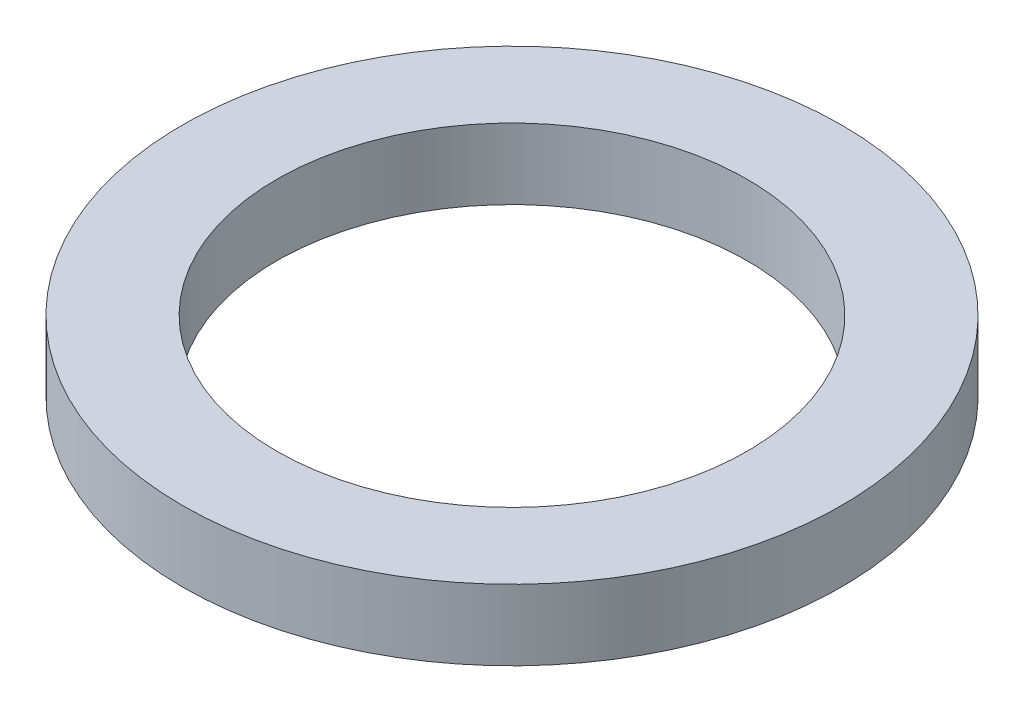
ISO-10303-21;
HEADER;
FILE_DESCRIPTION(('STEP AP214'),'2;1');
FILE_NAME('part.step','',(''),(''),'','','');
FILE_SCHEMA(('AUTOMOTIVE_DESIGN { 1 0 10303 214 1 1 1 1 }'));
ENDSEC;
DATA;
#1=APPLICATION_CONTEXT('core data for automotive mechanical design processes');
#2=APPLICATION_PROTOCOL_DEFINITION('international standard','automotive_design',2000,#1);
#3=PRODUCT_CONTEXT('',#1,'mechanical');
#4=PRODUCT('Part','Part','',(#3));
#5=PRODUCT_RELATED_PRODUCT_CATEGORY('part','',(#4));
#6=PRODUCT_DEFINITION_FORMATION('','',#4);
#7=PRODUCT_DEFINITION_CONTEXT('part definition',#1,'design');
#8=PRODUCT_DEFINITION('design','',#6,#7);
#9=PRODUCT_DEFINITION_SHAPE('','',#8);
#10=(LENGTH_UNIT() NAMED_UNIT(*) SI_UNIT(.MILLI.,.METRE.));
#11=(NAMED_UNIT(*) PLANE_ANGLE_UNIT() SI_UNIT($,.RADIAN.));
#12=(NAMED_UNIT(*) SI_UNIT($,.STERADIAN.) SOLID_ANGLE_UNIT());
#13=UNCERTAINTY_MEASURE_WITH_UNIT(LENGTH_MEASURE(1.E-05),#10,'distance_accuracy_value','');
#14=(GEOMETRIC_REPRESENTATION_CONTEXT(3) GLOBAL_UNCERTAINTY_ASSIGNED_CONTEXT((#13)) GLOBAL_UNIT_ASSIGNED_CONTEXT((#10,
#11,#12)) REPRESENTATION_CONTEXT('',''));
#15=CARTESIAN_POINT('',(0.,0.,0.));
#16=DIRECTION('',(0.,0.,1.));
#17=DIRECTION('',(1.,0.,0.));
#18=AXIS2_PLACEMENT_3D('',#15,#16,#17);
#19=CARTESIAN_POINT('',(0.,3.,0.));
#20=DIRECTION('',(0.,1.,0.));
#21=DIRECTION('',(0.,0.,1.));
#22=AXIS2_PLACEMENT_3D('',#19,#20,#21);
#23=PLANE('',#22);
#24=CARTESIAN_POINT('',(0.,3.,0.));
#25=DIRECTION('',(0.,1.,0.));
#26=DIRECTION('',(0.,0.,1.));
#27=AXIS2_PLACEMENT_3D('',#24,#25,#26);
#28=CIRCLE('',#27,14.);
#29=CARTESIAN_POINT('',(0.,3.,14.));
#30=VERTEX_POINT('',#29);
#31=EDGE_CURVE('E10',#30,#30,#28,.T.);
#32=ORIENTED_EDGE('',*,*,#31,.T.);
#33=EDGE_LOOP('',(#32));
#34=FACE_BOUND('',#33,.T.);
#35=CARTESIAN_POINT('',(0.,3.,0.));
#36=DIRECTION('',(0.,1.,0.));
#37=DIRECTION('',(0.,0.,1.));
#38=AXIS2_PLACEMENT_3D('',#35,#36,#37);
#39=CIRCLE('',#38,10.);
#40=CARTESIAN_POINT('',(0.,3.,10.));
#41=VERTEX_POINT('',#40);
#42=EDGE_CURVE('E42',#41,#41,#39,.T.);
#43=ORIENTED_EDGE('',*,*,#42,.F.);
#44=EDGE_LOOP('',(#43));
#45=FACE_BOUND('',#44,.T.);
#46=ADVANCED_FACE('F31',(#34,#45),#23,.T.);
#47=CARTESIAN_POINT('',(0.,0.,0.));
#48=DIRECTION('',(0.,1.,0.));
#49=DIRECTION('',(0.,0.,1.));
#50=AXIS2_PLACEMENT_3D('',#47,#48,#49);
#51=PLANE('',#50);
#52=CARTESIAN_POINT('',(0.,0.,0.));
#53=DIRECTION('',(0.,1.,0.));
#54=DIRECTION('',(0.,0.,1.));
#55=AXIS2_PLACEMENT_3D('',#52,#53,#54);
#56=CIRCLE('',#55,14.);
#57=CARTESIAN_POINT('',(0.,0.,14.));
#58=VERTEX_POINT('',#57);
#59=EDGE_CURVE('E35',#58,#58,#56,.T.);
#60=ORIENTED_EDGE('',*,*,#59,.F.);
#61=EDGE_LOOP('',(#60));
#62=FACE_BOUND('',#61,.T.);
#63=CARTESIAN_POINT('',(0.,0.,0.));
#64=DIRECTION('',(0.,1.,0.));
#65=DIRECTION('',(0.,0.,1.));
#66=AXIS2_PLACEMENT_3D('',#63,#64,#65);
#67=CIRCLE('',#66,10.);
#68=CARTESIAN_POINT('',(0.,0.,10.));
#69=VERTEX_POINT('',#68);
#70=EDGE_CURVE('E44',#69,#69,#67,.T.);
#71=ORIENTED_EDGE('',*,*,#70,.T.);
#72=EDGE_LOOP('',(#71));
#73=FACE_BOUND('',#72,.T.);
#74=ADVANCED_FACE('F54',(#62,#73),#51,.F.);
#75=CARTESIAN_POINT('',(0.,3.,0.));
#76=DIRECTION('',(0.,-1.,0.));
#77=DIRECTION('',(0.,0.,-1.));
#78=AXIS2_PLACEMENT_3D('',#75,#76,#77);
#79=CYLINDRICAL_SURFACE('',#78,14.);
#80=ORIENTED_EDGE('',*,*,#31,.F.);
#81=EDGE_LOOP('',(#80));
#82=FACE_BOUND('',#81,.T.);
#83=ORIENTED_EDGE('',*,*,#59,.T.);
#84=EDGE_LOOP('',(#83));
#85=FACE_BOUND('',#84,.T.);
#86=ADVANCED_FACE('F33',(#82,#85),#79,.T.);
#87=CARTESIAN_POINT('',(0.,3.,0.));
#88=DIRECTION('',(0.,-1.,0.));
#89=DIRECTION('',(0.,0.,-1.));
#90=AXIS2_PLACEMENT_3D('',#87,#88,#89);
#91=CYLINDRICAL_SURFACE('',#90,10.);
#92=ORIENTED_EDGE('',*,*,#42,.T.);
#93=EDGE_LOOP('',(#92));
#94=FACE_BOUND('',#93,.T.);
#95=ORIENTED_EDGE('',*,*,#70,.F.);
#96=EDGE_LOOP('',(#95));
#97=FACE_BOUND('',#96,.T.);
#98=ADVANCED_FACE('F50',(#94,#97),#91,.F.);
#99=CLOSED_SHELL('',(#46,#74,#86,#98));
#100=MANIFOLD_SOLID_BREP('B2',#99);
#101=ADVANCED_BREP_SHAPE_REPRESENTATION('',(#18,#100),#14);
#102=SHAPE_DEFINITION_REPRESENTATION(#9,#101);
ENDSEC;
END-ISO-10303-21;
